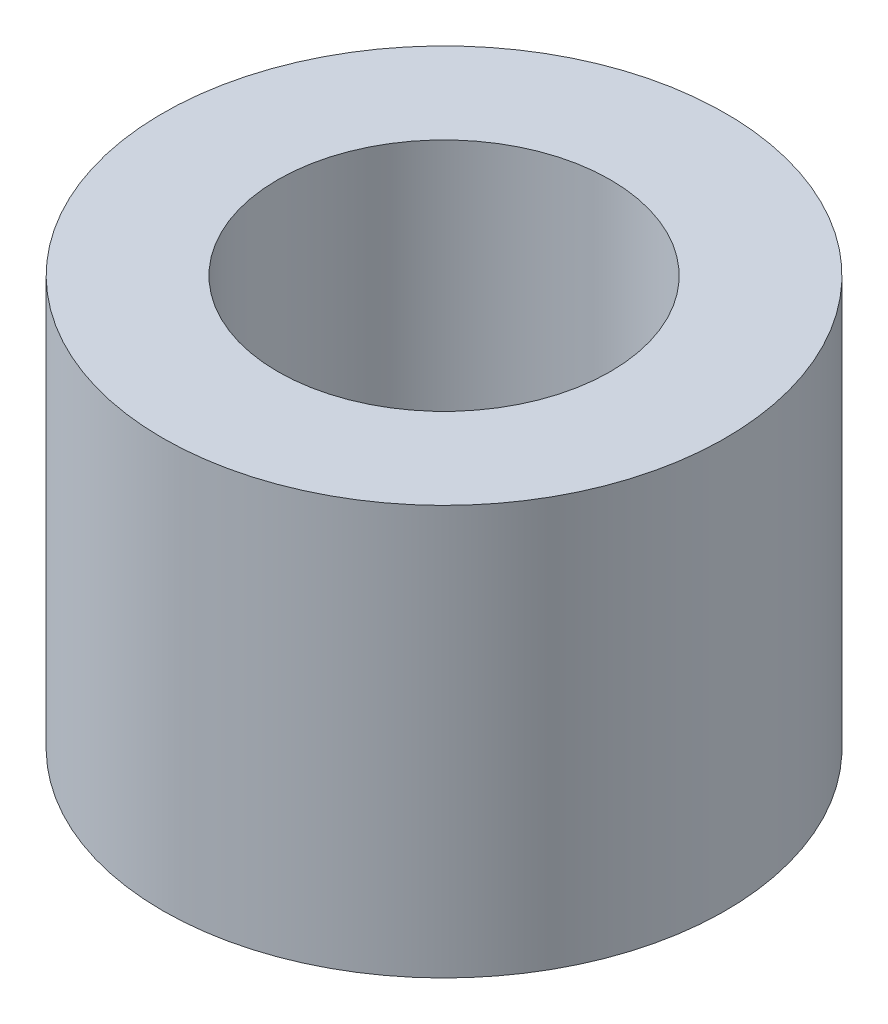
ISO-10303-21;
HEADER;
FILE_DESCRIPTION(('STEP AP214'),'2;1');
FILE_NAME('part.step','',(''),(''),'','','');
FILE_SCHEMA(('AUTOMOTIVE_DESIGN { 1 0 10303 214 1 1 1 1 }'));
ENDSEC;
DATA;
#1=APPLICATION_CONTEXT('core data for automotive mechanical design processes');
#2=APPLICATION_PROTOCOL_DEFINITION('international standard','automotive_design',2000,#1);
#3=PRODUCT_CONTEXT('',#1,'mechanical');
#4=PRODUCT('Part','Part','',(#3));
#5=PRODUCT_RELATED_PRODUCT_CATEGORY('part','',(#4));
#6=PRODUCT_DEFINITION_FORMATION('','',#4);
#7=PRODUCT_DEFINITION_CONTEXT('part definition',#1,'design');
#8=PRODUCT_DEFINITION('design','',#6,#7);
#9=PRODUCT_DEFINITION_SHAPE('','',#8);
#10=(LENGTH_UNIT() NAMED_UNIT(*) SI_UNIT(.MILLI.,.METRE.));
#11=(NAMED_UNIT(*) PLANE_ANGLE_UNIT() SI_UNIT($,.RADIAN.));
#12=(NAMED_UNIT(*) SI_UNIT($,.STERADIAN.) SOLID_ANGLE_UNIT());
#13=UNCERTAINTY_MEASURE_WITH_UNIT(LENGTH_MEASURE(1.E-05),#10,'distance_accuracy_value','');
#14=(GEOMETRIC_REPRESENTATION_CONTEXT(3) GLOBAL_UNCERTAINTY_ASSIGNED_CONTEXT((#13)) GLOBAL_UNIT_ASSIGNED_CONTEXT((#10,
#11,#12)) REPRESENTATION_CONTEXT('',''));
#15=CARTESIAN_POINT('',(0.,0.,0.));
#16=DIRECTION('',(0.,0.,1.));
#17=DIRECTION('',(1.,0.,0.));
#18=AXIS2_PLACEMENT_3D('',#15,#16,#17);
#19=CARTESIAN_POINT('',(0.,4.,0.));
#20=DIRECTION('',(0.,1.,0.));
#21=DIRECTION('',(0.,0.,1.));
#22=AXIS2_PLACEMENT_3D('',#19,#20,#21);
#23=PLANE('',#22);
#24=CARTESIAN_POINT('',(0.,4.,0.));
#25=DIRECTION('',(0.,1.,0.));
#26=DIRECTION('',(0.,0.,1.));
#27=AXIS2_PLACEMENT_3D('',#24,#25,#26);
#28=CIRCLE('',#27,2.75);
#29=CARTESIAN_POINT('',(0.,4.,2.75));
#30=VERTEX_POINT('',#29);
#31=EDGE_CURVE('E10',#30,#30,#28,.T.);
#32=ORIENTED_EDGE('',*,*,#31,.T.);
#33=EDGE_LOOP('',(#32));
#34=FACE_BOUND('',#33,.T.);
#35=CARTESIAN_POINT('',(0.,4.,0.));
#36=DIRECTION('',(0.,1.,0.));
#37=DIRECTION('',(0.,0.,1.));
#38=AXIS2_PLACEMENT_3D('',#35,#36,#37);
#39=CIRCLE('',#38,1.625);
#40=CARTESIAN_POINT('',(0.,4.,1.625));
#41=VERTEX_POINT('',#40);
#42=EDGE_CURVE('E48',#41,#41,#39,.T.);
#43=ORIENTED_EDGE('',*,*,#42,.F.);
#44=EDGE_LOOP('',(#43));
#45=FACE_BOUND('',#44,.T.);
#46=ADVANCED_FACE('F37',(#34,#45),#23,.T.);
#47=CARTESIAN_POINT('',(0.,0.,0.));
#48=DIRECTION('',(0.,1.,0.));
#49=DIRECTION('',(0.,0.,1.));
#50=AXIS2_PLACEMENT_3D('',#47,#48,#49);
#51=PLANE('',#50);
#52=CARTESIAN_POINT('',(0.,0.,0.));
#53=DIRECTION('',(0.,1.,0.));
#54=DIRECTION('',(0.,0.,1.));
#55=AXIS2_PLACEMENT_3D('',#52,#53,#54);
#56=CIRCLE('',#55,2.75);
#57=CARTESIAN_POINT('',(0.,0.,2.75));
#58=VERTEX_POINT('',#57);
#59=EDGE_CURVE('E41',#58,#58,#56,.T.);
#60=ORIENTED_EDGE('',*,*,#59,.F.);
#61=EDGE_LOOP('',(#60));
#62=FACE_BOUND('',#61,.T.);
#63=CARTESIAN_POINT('',(0.,0.,0.));
#64=DIRECTION('',(0.,1.,0.));
#65=DIRECTION('',(0.,0.,1.));
#66=AXIS2_PLACEMENT_3D('',#63,#64,#65);
#67=CIRCLE('',#66,1.625);
#68=CARTESIAN_POINT('',(0.,0.,1.625));
#69=VERTEX_POINT('',#68);
#70=EDGE_CURVE('E50',#69,#69,#67,.T.);
#71=ORIENTED_EDGE('',*,*,#70,.T.);
#72=EDGE_LOOP('',(#71));
#73=FACE_BOUND('',#72,.T.);
#74=ADVANCED_FACE('F60',(#62,#73),#51,.F.);
#75=CARTESIAN_POINT('',(0.,4.,0.));
#76=DIRECTION('',(0.,-1.,0.));
#77=DIRECTION('',(0.,0.,-1.));
#78=AXIS2_PLACEMENT_3D('',#75,#76,#77);
#79=CYLINDRICAL_SURFACE('',#78,2.75);
#80=ORIENTED_EDGE('',*,*,#31,.F.);
#81=EDGE_LOOP('',(#80));
#82=FACE_BOUND('',#81,.T.);
#83=ORIENTED_EDGE('',*,*,#59,.T.);
#84=EDGE_LOOP('',(#83));
#85=FACE_BOUND('',#84,.T.);
#86=ADVANCED_FACE('F39',(#82,#85),#79,.T.);
#87=CARTESIAN_POINT('',(0.,4.,0.));
#88=DIRECTION('',(0.,-1.,0.));
#89=DIRECTION('',(0.,0.,-1.));
#90=AXIS2_PLACEMENT_3D('',#87,#88,#89);
#91=CYLINDRICAL_SURFACE('',#90,1.625);
#92=ORIENTED_EDGE('',*,*,#42,.T.);
#93=EDGE_LOOP('',(#92));
#94=FACE_BOUND('',#93,.T.);
#95=ORIENTED_EDGE('',*,*,#70,.F.);
#96=EDGE_LOOP('',(#95));
#97=FACE_BOUND('',#96,.T.);
#98=ADVANCED_FACE('F56',(#94,#97),#91,.F.);
#99=CLOSED_SHELL('',(#46,#74,#86,#98));
#100=MANIFOLD_SOLID_BREP('B2',#99);
#101=ADVANCED_BREP_SHAPE_REPRESENTATION('',(#18,#100),#14);
#102=SHAPE_DEFINITION_REPRESENTATION(#9,#101);
ENDSEC;
END-ISO-10303-21;
